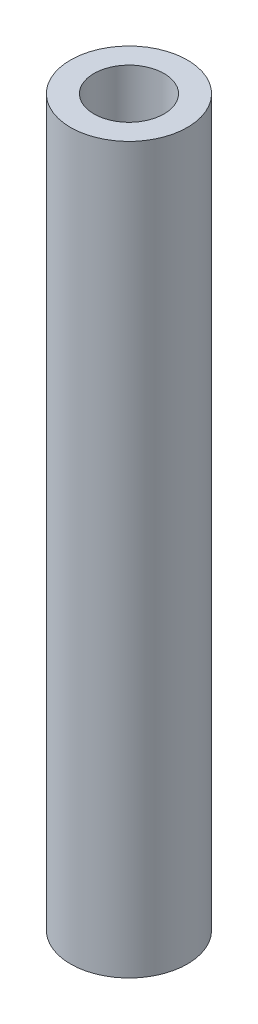
ISO-10303-21;
HEADER;
FILE_DESCRIPTION(('STEP AP214'),'2;1');
FILE_NAME('part.step','',(''),(''),'','','');
FILE_SCHEMA(('AUTOMOTIVE_DESIGN { 1 0 10303 214 1 1 1 1 }'));
ENDSEC;
DATA;
#1=APPLICATION_CONTEXT('core data for automotive mechanical design processes');
#2=APPLICATION_PROTOCOL_DEFINITION('international standard','automotive_design',2000,#1);
#3=PRODUCT_CONTEXT('',#1,'mechanical');
#4=PRODUCT('Part','Part','',(#3));
#5=PRODUCT_RELATED_PRODUCT_CATEGORY('part','',(#4));
#6=PRODUCT_DEFINITION_FORMATION('','',#4);
#7=PRODUCT_DEFINITION_CONTEXT('part definition',#1,'design');
#8=PRODUCT_DEFINITION('design','',#6,#7);
#9=PRODUCT_DEFINITION_SHAPE('','',#8);
#10=(LENGTH_UNIT() NAMED_UNIT(*) SI_UNIT(.MILLI.,.METRE.));
#11=(NAMED_UNIT(*) PLANE_ANGLE_UNIT() SI_UNIT($,.RADIAN.));
#12=(NAMED_UNIT(*) SI_UNIT($,.STERADIAN.) SOLID_ANGLE_UNIT());
#13=UNCERTAINTY_MEASURE_WITH_UNIT(LENGTH_MEASURE(1.E-05),#10,'distance_accuracy_value','');
#14=(GEOMETRIC_REPRESENTATION_CONTEXT(3) GLOBAL_UNCERTAINTY_ASSIGNED_CONTEXT((#13)) GLOBAL_UNIT_ASSIGNED_CONTEXT((#10,
#11,#12)) REPRESENTATION_CONTEXT('',''));
#15=CARTESIAN_POINT('',(0.,0.,0.));
#16=DIRECTION('',(0.,0.,1.));
#17=DIRECTION('',(1.,0.,0.));
#18=AXIS2_PLACEMENT_3D('',#15,#16,#17);
#19=CARTESIAN_POINT('',(0.,62.,0.));
#20=DIRECTION('',(0.,1.,0.));
#21=DIRECTION('',(0.,0.,1.));
#22=AXIS2_PLACEMENT_3D('',#19,#20,#21);
#23=PLANE('',#22);
#24=CARTESIAN_POINT('',(0.,62.,0.));
#25=DIRECTION('',(0.,1.,0.));
#26=DIRECTION('',(0.,0.,1.));
#27=AXIS2_PLACEMENT_3D('',#24,#25,#26);
#28=CIRCLE('',#27,5.);
#29=CARTESIAN_POINT('',(0.,62.,5.));
#30=VERTEX_POINT('',#29);
#31=EDGE_CURVE('E10',#30,#30,#28,.T.);
#32=ORIENTED_EDGE('',*,*,#31,.T.);
#33=EDGE_LOOP('',(#32));
#34=FACE_BOUND('',#33,.T.);
#35=CARTESIAN_POINT('',(0.,62.,0.));
#36=DIRECTION('',(0.,1.,0.));
#37=DIRECTION('',(0.,0.,1.));
#38=AXIS2_PLACEMENT_3D('',#35,#36,#37);
#39=CIRCLE('',#38,3.);
#40=CARTESIAN_POINT('',(0.,62.,3.));
#41=VERTEX_POINT('',#40);
#42=EDGE_CURVE('E54',#41,#41,#39,.T.);
#43=ORIENTED_EDGE('',*,*,#42,.F.);
#44=EDGE_LOOP('',(#43));
#45=FACE_BOUND('',#44,.T.);
#46=ADVANCED_FACE('F41',(#34,#45),#23,.T.);
#47=CARTESIAN_POINT('',(0.,0.,0.));
#48=DIRECTION('',(0.,1.,0.));
#49=DIRECTION('',(0.,0.,1.));
#50=AXIS2_PLACEMENT_3D('',#47,#48,#49);
#51=PLANE('',#50);
#52=CARTESIAN_POINT('',(0.,0.,0.));
#53=DIRECTION('',(0.,1.,0.));
#54=DIRECTION('',(0.,0.,1.));
#55=AXIS2_PLACEMENT_3D('',#52,#53,#54);
#56=CIRCLE('',#55,5.);
#57=CARTESIAN_POINT('',(0.,0.,5.));
#58=VERTEX_POINT('',#57);
#59=EDGE_CURVE('E45',#58,#58,#56,.T.);
#60=ORIENTED_EDGE('',*,*,#59,.F.);
#61=EDGE_LOOP('',(#60));
#62=FACE_BOUND('',#61,.T.);
#63=CARTESIAN_POINT('',(0.,0.,0.));
#64=DIRECTION('',(0.,1.,0.));
#65=DIRECTION('',(0.,0.,1.));
#66=AXIS2_PLACEMENT_3D('',#63,#64,#65);
#67=CIRCLE('',#66,3.);
#68=CARTESIAN_POINT('',(0.,0.,3.));
#69=VERTEX_POINT('',#68);
#70=EDGE_CURVE('E56',#69,#69,#67,.T.);
#71=ORIENTED_EDGE('',*,*,#70,.T.);
#72=EDGE_LOOP('',(#71));
#73=FACE_BOUND('',#72,.T.);
#74=ADVANCED_FACE('F68',(#62,#73),#51,.F.);
#75=CARTESIAN_POINT('',(0.,62.,0.));
#76=DIRECTION('',(0.,-1.,0.));
#77=DIRECTION('',(0.,0.,-1.));
#78=AXIS2_PLACEMENT_3D('',#75,#76,#77);
#79=CYLINDRICAL_SURFACE('',#78,5.);
#80=ORIENTED_EDGE('',*,*,#31,.F.);
#81=EDGE_LOOP('',(#80));
#82=FACE_BOUND('',#81,.T.);
#83=ORIENTED_EDGE('',*,*,#59,.T.);
#84=EDGE_LOOP('',(#83));
#85=FACE_BOUND('',#84,.T.);
#86=ADVANCED_FACE('F43',(#82,#85),#79,.T.);
#87=CARTESIAN_POINT('',(0.,62.,0.));
#88=DIRECTION('',(0.,-1.,0.));
#89=DIRECTION('',(0.,0.,-1.));
#90=AXIS2_PLACEMENT_3D('',#87,#88,#89);
#91=CYLINDRICAL_SURFACE('',#90,3.);
#92=ORIENTED_EDGE('',*,*,#42,.T.);
#93=EDGE_LOOP('',(#92));
#94=FACE_BOUND('',#93,.T.);
#95=ORIENTED_EDGE('',*,*,#70,.F.);
#96=EDGE_LOOP('',(#95));
#97=FACE_BOUND('',#96,.T.);
#98=ADVANCED_FACE('F64',(#94,#97),#91,.F.);
#99=CLOSED_SHELL('',(#46,#74,#86,#98));
#100=MANIFOLD_SOLID_BREP('B2',#99);
#101=ADVANCED_BREP_SHAPE_REPRESENTATION('',(#18,#100),#14);
#102=SHAPE_DEFINITION_REPRESENTATION(#9,#101);
ENDSEC;
END-ISO-10303-21;
